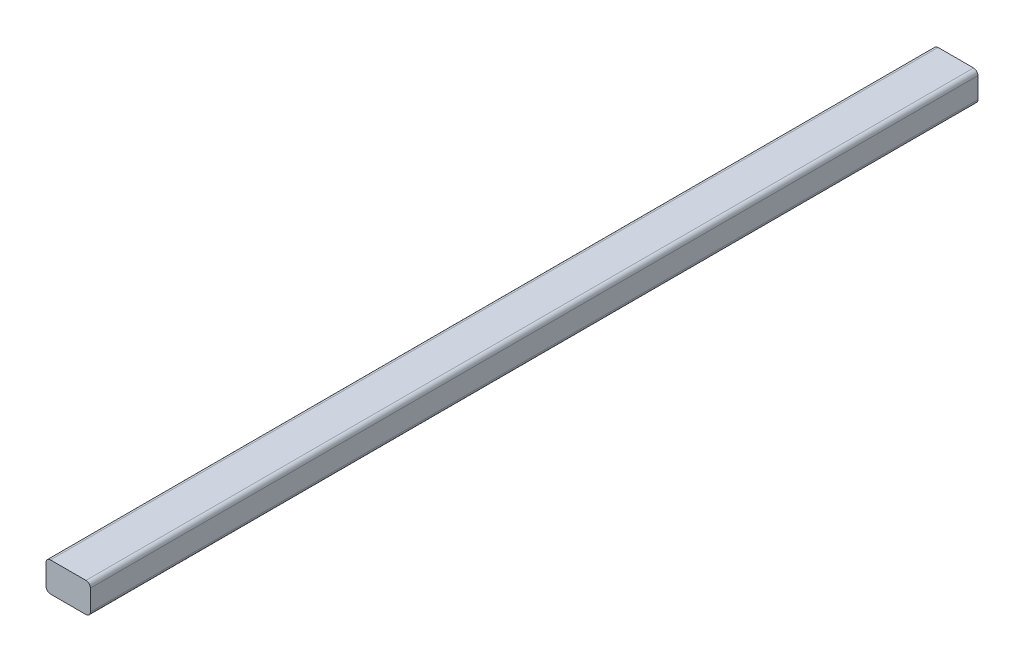
ISO-10303-21;
HEADER;
FILE_DESCRIPTION(('STEP AP214'),'2;1');
FILE_NAME('part.step','',(''),(''),'','','');
FILE_SCHEMA(('AUTOMOTIVE_DESIGN { 1 0 10303 214 1 1 1 1 }'));
ENDSEC;
DATA;
#1=APPLICATION_CONTEXT('core data for automotive mechanical design processes');
#2=APPLICATION_PROTOCOL_DEFINITION('international standard','automotive_design',2000,#1);
#3=PRODUCT_CONTEXT('',#1,'mechanical');
#4=PRODUCT('Part','Part','',(#3));
#5=PRODUCT_RELATED_PRODUCT_CATEGORY('part','',(#4));
#6=PRODUCT_DEFINITION_FORMATION('','',#4);
#7=PRODUCT_DEFINITION_CONTEXT('part definition',#1,'design');
#8=PRODUCT_DEFINITION('design','',#6,#7);
#9=PRODUCT_DEFINITION_SHAPE('','',#8);
#10=(LENGTH_UNIT() NAMED_UNIT(*) SI_UNIT(.MILLI.,.METRE.));
#11=(NAMED_UNIT(*) PLANE_ANGLE_UNIT() SI_UNIT($,.RADIAN.));
#12=(NAMED_UNIT(*) SI_UNIT($,.STERADIAN.) SOLID_ANGLE_UNIT());
#13=UNCERTAINTY_MEASURE_WITH_UNIT(LENGTH_MEASURE(1.E-05),#10,'distance_accuracy_value','');
#14=(GEOMETRIC_REPRESENTATION_CONTEXT(3) GLOBAL_UNCERTAINTY_ASSIGNED_CONTEXT((#13)) GLOBAL_UNIT_ASSIGNED_CONTEXT((#10,
#11,#12)) REPRESENTATION_CONTEXT('',''));
#15=CARTESIAN_POINT('',(0.,0.,0.));
#16=DIRECTION('',(0.,0.,1.));
#17=DIRECTION('',(1.,0.,0.));
#18=AXIS2_PLACEMENT_3D('',#15,#16,#17);
#19=CARTESIAN_POINT('',(0.,0.,600.));
#20=DIRECTION('',(1.,0.,0.));
#21=DIRECTION('',(0.,0.,-1.));
#22=AXIS2_PLACEMENT_3D('',#19,#20,#21);
#23=PLANE('',#22);
#24=DIRECTION('',(0.,-1.,0.));
#25=VECTOR('',#24,1.);
#26=CARTESIAN_POINT('',(0.,0.,0.));
#27=LINE('',#26,#25);
#28=CARTESIAN_POINT('',(0.,17.,0.));
#29=VERTEX_POINT('',#28);
#30=CARTESIAN_POINT('',(0.,3.,0.));
#31=VERTEX_POINT('',#30);
#32=EDGE_CURVE('E128',#29,#31,#27,.T.);
#33=ORIENTED_EDGE('',*,*,#32,.T.);
#34=DIRECTION('',(0.,0.,-1.));
#35=VECTOR('',#34,1.);
#36=CARTESIAN_POINT('',(0.,3.,600.));
#37=LINE('',#36,#35);
#38=CARTESIAN_POINT('',(0.,3.,600.));
#39=VERTEX_POINT('',#38);
#40=EDGE_CURVE('E151',#31,#39,#37,.F.);
#41=ORIENTED_EDGE('',*,*,#40,.T.);
#42=DIRECTION('',(0.,-1.,0.));
#43=VECTOR('',#42,1.);
#44=CARTESIAN_POINT('',(0.,0.,600.));
#45=LINE('',#44,#43);
#46=CARTESIAN_POINT('',(0.,17.,600.));
#47=VERTEX_POINT('',#46);
#48=EDGE_CURVE('E126',#47,#39,#45,.T.);
#49=ORIENTED_EDGE('',*,*,#48,.F.);
#50=DIRECTION('',(0.,0.,-1.));
#51=VECTOR('',#50,1.);
#52=CARTESIAN_POINT('',(0.,17.,600.));
#53=LINE('',#52,#51);
#54=EDGE_CURVE('E148',#47,#29,#53,.T.);
#55=ORIENTED_EDGE('',*,*,#54,.T.);
#56=EDGE_LOOP('',(#33,#41,#49,#55));
#57=FACE_BOUND('',#56,.T.);
#58=ADVANCED_FACE('F33',(#57),#23,.F.);
#59=CARTESIAN_POINT('',(0.,0.,600.));
#60=DIRECTION('',(0.,1.,0.));
#61=DIRECTION('',(0.,0.,1.));
#62=AXIS2_PLACEMENT_3D('',#59,#60,#61);
#63=PLANE('',#62);
#64=DIRECTION('',(1.,0.,0.));
#65=VECTOR('',#64,1.);
#66=CARTESIAN_POINT('',(0.,0.,0.));
#67=LINE('',#66,#65);
#68=CARTESIAN_POINT('',(3.,0.,0.));
#69=VERTEX_POINT('',#68);
#70=CARTESIAN_POINT('',(27.,0.,0.));
#71=VERTEX_POINT('',#70);
#72=EDGE_CURVE('E124',#69,#71,#67,.T.);
#73=ORIENTED_EDGE('',*,*,#72,.T.);
#74=DIRECTION('',(0.,0.,-1.));
#75=VECTOR('',#74,1.);
#76=CARTESIAN_POINT('',(27.,0.,600.));
#77=LINE('',#76,#75);
#78=CARTESIAN_POINT('',(27.,0.,600.));
#79=VERTEX_POINT('',#78);
#80=EDGE_CURVE('E103',#71,#79,#77,.F.);
#81=ORIENTED_EDGE('',*,*,#80,.T.);
#82=DIRECTION('',(1.,0.,0.));
#83=VECTOR('',#82,1.);
#84=CARTESIAN_POINT('',(0.,0.,600.));
#85=LINE('',#84,#83);
#86=CARTESIAN_POINT('',(3.,0.,600.));
#87=VERTEX_POINT('',#86);
#88=EDGE_CURVE('E167',#87,#79,#85,.T.);
#89=ORIENTED_EDGE('',*,*,#88,.F.);
#90=DIRECTION('',(0.,0.,-1.));
#91=VECTOR('',#90,1.);
#92=CARTESIAN_POINT('',(3.,0.,600.));
#93=LINE('',#92,#91);
#94=EDGE_CURVE('E108',#87,#69,#93,.T.);
#95=ORIENTED_EDGE('',*,*,#94,.T.);
#96=EDGE_LOOP('',(#73,#81,#89,#95));
#97=FACE_BOUND('',#96,.T.);
#98=ADVANCED_FACE('F184',(#97),#63,.F.);
#99=CARTESIAN_POINT('',(30.,0.,600.));
#100=DIRECTION('',(-1.,0.,0.));
#101=DIRECTION('',(0.,0.,1.));
#102=AXIS2_PLACEMENT_3D('',#99,#100,#101);
#103=PLANE('',#102);
#104=DIRECTION('',(0.,1.,0.));
#105=VECTOR('',#104,1.);
#106=CARTESIAN_POINT('',(30.,0.,600.));
#107=LINE('',#106,#105);
#108=CARTESIAN_POINT('',(30.,3.,600.));
#109=VERTEX_POINT('',#108);
#110=CARTESIAN_POINT('',(30.,17.,600.));
#111=VERTEX_POINT('',#110);
#112=EDGE_CURVE('E117',#109,#111,#107,.T.);
#113=ORIENTED_EDGE('',*,*,#112,.F.);
#114=DIRECTION('',(0.,0.,-1.));
#115=VECTOR('',#114,1.);
#116=CARTESIAN_POINT('',(30.,3.,600.));
#117=LINE('',#116,#115);
#118=CARTESIAN_POINT('',(30.,3.,0.));
#119=VERTEX_POINT('',#118);
#120=EDGE_CURVE('E102',#109,#119,#117,.T.);
#121=ORIENTED_EDGE('',*,*,#120,.T.);
#122=DIRECTION('',(0.,1.,0.));
#123=VECTOR('',#122,1.);
#124=CARTESIAN_POINT('',(30.,0.,0.));
#125=LINE('',#124,#123);
#126=CARTESIAN_POINT('',(30.,17.,0.));
#127=VERTEX_POINT('',#126);
#128=EDGE_CURVE('E115',#119,#127,#125,.T.);
#129=ORIENTED_EDGE('',*,*,#128,.T.);
#130=DIRECTION('',(0.,0.,-1.));
#131=VECTOR('',#130,1.);
#132=CARTESIAN_POINT('',(30.,17.,600.));
#133=LINE('',#132,#131);
#134=EDGE_CURVE('E119',#127,#111,#133,.F.);
#135=ORIENTED_EDGE('',*,*,#134,.T.);
#136=EDGE_LOOP('',(#113,#121,#129,#135));
#137=FACE_BOUND('',#136,.T.);
#138=ADVANCED_FACE('F114',(#137),#103,.F.);
#139=CARTESIAN_POINT('',(0.,20.,600.));
#140=DIRECTION('',(0.,-1.,0.));
#141=DIRECTION('',(0.,0.,-1.));
#142=AXIS2_PLACEMENT_3D('',#139,#140,#141);
#143=PLANE('',#142);
#144=DIRECTION('',(-1.,0.,0.));
#145=VECTOR('',#144,1.);
#146=CARTESIAN_POINT('',(0.,20.,0.));
#147=LINE('',#146,#145);
#148=CARTESIAN_POINT('',(27.,20.,0.));
#149=VERTEX_POINT('',#148);
#150=CARTESIAN_POINT('',(3.,20.,0.));
#151=VERTEX_POINT('',#150);
#152=EDGE_CURVE('E123',#149,#151,#147,.T.);
#153=ORIENTED_EDGE('',*,*,#152,.T.);
#154=DIRECTION('',(0.,0.,-1.));
#155=VECTOR('',#154,1.);
#156=CARTESIAN_POINT('',(3.,20.,600.));
#157=LINE('',#156,#155);
#158=CARTESIAN_POINT('',(3.,20.,600.));
#159=VERTEX_POINT('',#158);
#160=EDGE_CURVE('E11',#151,#159,#157,.F.);
#161=ORIENTED_EDGE('',*,*,#160,.T.);
#162=DIRECTION('',(-1.,0.,0.));
#163=VECTOR('',#162,1.);
#164=CARTESIAN_POINT('',(0.,20.,600.));
#165=LINE('',#164,#163);
#166=CARTESIAN_POINT('',(27.,20.,600.));
#167=VERTEX_POINT('',#166);
#168=EDGE_CURVE('E132',#167,#159,#165,.T.);
#169=ORIENTED_EDGE('',*,*,#168,.F.);
#170=DIRECTION('',(0.,0.,-1.));
#171=VECTOR('',#170,1.);
#172=CARTESIAN_POINT('',(27.,20.,600.));
#173=LINE('',#172,#171);
#174=EDGE_CURVE('E41',#167,#149,#173,.T.);
#175=ORIENTED_EDGE('',*,*,#174,.T.);
#176=EDGE_LOOP('',(#153,#161,#169,#175));
#177=FACE_BOUND('',#176,.T.);
#178=ADVANCED_FACE('F154',(#177),#143,.F.);
#179=CARTESIAN_POINT('',(0.,0.,600.));
#180=DIRECTION('',(0.,0.,-1.));
#181=DIRECTION('',(-1.,0.,0.));
#182=AXIS2_PLACEMENT_3D('',#179,#180,#181);
#183=PLANE('',#182);
#184=ORIENTED_EDGE('',*,*,#88,.T.);
#185=CARTESIAN_POINT('',(27.,3.,600.));
#186=DIRECTION('',(0.,0.,-1.));
#187=DIRECTION('',(-1.,0.,0.));
#188=AXIS2_PLACEMENT_3D('',#185,#186,#187);
#189=CIRCLE('',#188,3.);
#190=EDGE_CURVE('E146',#79,#109,#189,.F.);
#191=ORIENTED_EDGE('',*,*,#190,.T.);
#192=ORIENTED_EDGE('',*,*,#112,.T.);
#193=CARTESIAN_POINT('',(27.,17.,600.));
#194=DIRECTION('',(0.,0.,-1.));
#195=DIRECTION('',(-1.,0.,0.));
#196=AXIS2_PLACEMENT_3D('',#193,#194,#195);
#197=CIRCLE('',#196,3.);
#198=EDGE_CURVE('E53',#111,#167,#197,.F.);
#199=ORIENTED_EDGE('',*,*,#198,.T.);
#200=ORIENTED_EDGE('',*,*,#168,.T.);
#201=CARTESIAN_POINT('',(3.,17.,600.));
#202=DIRECTION('',(0.,0.,-1.));
#203=DIRECTION('',(-1.,0.,0.));
#204=AXIS2_PLACEMENT_3D('',#201,#202,#203);
#205=CIRCLE('',#204,3.);
#206=EDGE_CURVE('E142',#159,#47,#205,.F.);
#207=ORIENTED_EDGE('',*,*,#206,.T.);
#208=ORIENTED_EDGE('',*,*,#48,.T.);
#209=CARTESIAN_POINT('',(3.,3.,600.));
#210=DIRECTION('',(0.,0.,-1.));
#211=DIRECTION('',(-1.,0.,0.));
#212=AXIS2_PLACEMENT_3D('',#209,#210,#211);
#213=CIRCLE('',#212,3.);
#214=EDGE_CURVE('E144',#39,#87,#213,.F.);
#215=ORIENTED_EDGE('',*,*,#214,.T.);
#216=EDGE_LOOP('',(#184,#191,#192,#199,#200,#207,#208,#215));
#217=FACE_BOUND('',#216,.T.);
#218=ADVANCED_FACE('F173',(#217),#183,.F.);
#219=CARTESIAN_POINT('',(0.,0.,0.));
#220=DIRECTION('',(0.,0.,-1.));
#221=DIRECTION('',(-1.,0.,0.));
#222=AXIS2_PLACEMENT_3D('',#219,#220,#221);
#223=PLANE('',#222);
#224=ORIENTED_EDGE('',*,*,#128,.F.);
#225=CARTESIAN_POINT('',(27.,3.,0.));
#226=DIRECTION('',(0.,0.,-1.));
#227=DIRECTION('',(-1.,0.,0.));
#228=AXIS2_PLACEMENT_3D('',#225,#226,#227);
#229=CIRCLE('',#228,3.);
#230=EDGE_CURVE('E98',#119,#71,#229,.T.);
#231=ORIENTED_EDGE('',*,*,#230,.T.);
#232=ORIENTED_EDGE('',*,*,#72,.F.);
#233=CARTESIAN_POINT('',(3.,3.,0.));
#234=DIRECTION('',(0.,0.,-1.));
#235=DIRECTION('',(-1.,0.,0.));
#236=AXIS2_PLACEMENT_3D('',#233,#234,#235);
#237=CIRCLE('',#236,3.);
#238=EDGE_CURVE('E109',#69,#31,#237,.T.);
#239=ORIENTED_EDGE('',*,*,#238,.T.);
#240=ORIENTED_EDGE('',*,*,#32,.F.);
#241=CARTESIAN_POINT('',(3.,17.,0.));
#242=DIRECTION('',(0.,0.,-1.));
#243=DIRECTION('',(-1.,0.,0.));
#244=AXIS2_PLACEMENT_3D('',#241,#242,#243);
#245=CIRCLE('',#244,3.);
#246=EDGE_CURVE('E135',#29,#151,#245,.T.);
#247=ORIENTED_EDGE('',*,*,#246,.T.);
#248=ORIENTED_EDGE('',*,*,#152,.F.);
#249=CARTESIAN_POINT('',(27.,17.,0.));
#250=DIRECTION('',(0.,0.,-1.));
#251=DIRECTION('',(-1.,0.,0.));
#252=AXIS2_PLACEMENT_3D('',#249,#250,#251);
#253=CIRCLE('',#252,3.);
#254=EDGE_CURVE('E118',#149,#127,#253,.T.);
#255=ORIENTED_EDGE('',*,*,#254,.T.);
#256=EDGE_LOOP('',(#224,#231,#232,#239,#240,#247,#248,#255));
#257=FACE_BOUND('',#256,.T.);
#258=ADVANCED_FACE('F121',(#257),#223,.T.);
#259=CARTESIAN_POINT('',(27.,3.,600.));
#260=DIRECTION('',(0.,0.,-1.));
#261=DIRECTION('',(-1.,0.,0.));
#262=AXIS2_PLACEMENT_3D('',#259,#260,#261);
#263=CYLINDRICAL_SURFACE('',#262,3.);
#264=ORIENTED_EDGE('',*,*,#190,.F.);
#265=ORIENTED_EDGE('',*,*,#80,.F.);
#266=ORIENTED_EDGE('',*,*,#230,.F.);
#267=ORIENTED_EDGE('',*,*,#120,.F.);
#268=EDGE_LOOP('',(#264,#265,#266,#267));
#269=FACE_BOUND('',#268,.T.);
#270=ADVANCED_FACE('F101',(#269),#263,.T.);
#271=CARTESIAN_POINT('',(3.,3.,600.));
#272=DIRECTION('',(0.,0.,-1.));
#273=DIRECTION('',(-1.,0.,0.));
#274=AXIS2_PLACEMENT_3D('',#271,#272,#273);
#275=CYLINDRICAL_SURFACE('',#274,3.);
#276=ORIENTED_EDGE('',*,*,#214,.F.);
#277=ORIENTED_EDGE('',*,*,#40,.F.);
#278=ORIENTED_EDGE('',*,*,#238,.F.);
#279=ORIENTED_EDGE('',*,*,#94,.F.);
#280=EDGE_LOOP('',(#276,#277,#278,#279));
#281=FACE_BOUND('',#280,.T.);
#282=ADVANCED_FACE('F195',(#281),#275,.T.);
#283=CARTESIAN_POINT('',(3.,17.,600.));
#284=DIRECTION('',(0.,0.,-1.));
#285=DIRECTION('',(-1.,0.,0.));
#286=AXIS2_PLACEMENT_3D('',#283,#284,#285);
#287=CYLINDRICAL_SURFACE('',#286,3.);
#288=ORIENTED_EDGE('',*,*,#206,.F.);
#289=ORIENTED_EDGE('',*,*,#160,.F.);
#290=ORIENTED_EDGE('',*,*,#246,.F.);
#291=ORIENTED_EDGE('',*,*,#54,.F.);
#292=EDGE_LOOP('',(#288,#289,#290,#291));
#293=FACE_BOUND('',#292,.T.);
#294=ADVANCED_FACE('F161',(#293),#287,.T.);
#295=CARTESIAN_POINT('',(27.,17.,600.));
#296=DIRECTION('',(0.,0.,-1.));
#297=DIRECTION('',(-1.,0.,0.));
#298=AXIS2_PLACEMENT_3D('',#295,#296,#297);
#299=CYLINDRICAL_SURFACE('',#298,3.);
#300=ORIENTED_EDGE('',*,*,#198,.F.);
#301=ORIENTED_EDGE('',*,*,#134,.F.);
#302=ORIENTED_EDGE('',*,*,#254,.F.);
#303=ORIENTED_EDGE('',*,*,#174,.F.);
#304=EDGE_LOOP('',(#300,#301,#302,#303));
#305=FACE_BOUND('',#304,.T.);
#306=ADVANCED_FACE('F35',(#305),#299,.T.);
#307=CLOSED_SHELL('',(#58,#98,#138,#178,#218,#258,#270,#282,#294,#306));
#308=MANIFOLD_SOLID_BREP('B2',#307);
#309=ADVANCED_BREP_SHAPE_REPRESENTATION('',(#18,#308),#14);
#310=SHAPE_DEFINITION_REPRESENTATION(#9,#309);
ENDSEC;
END-ISO-10303-21;
